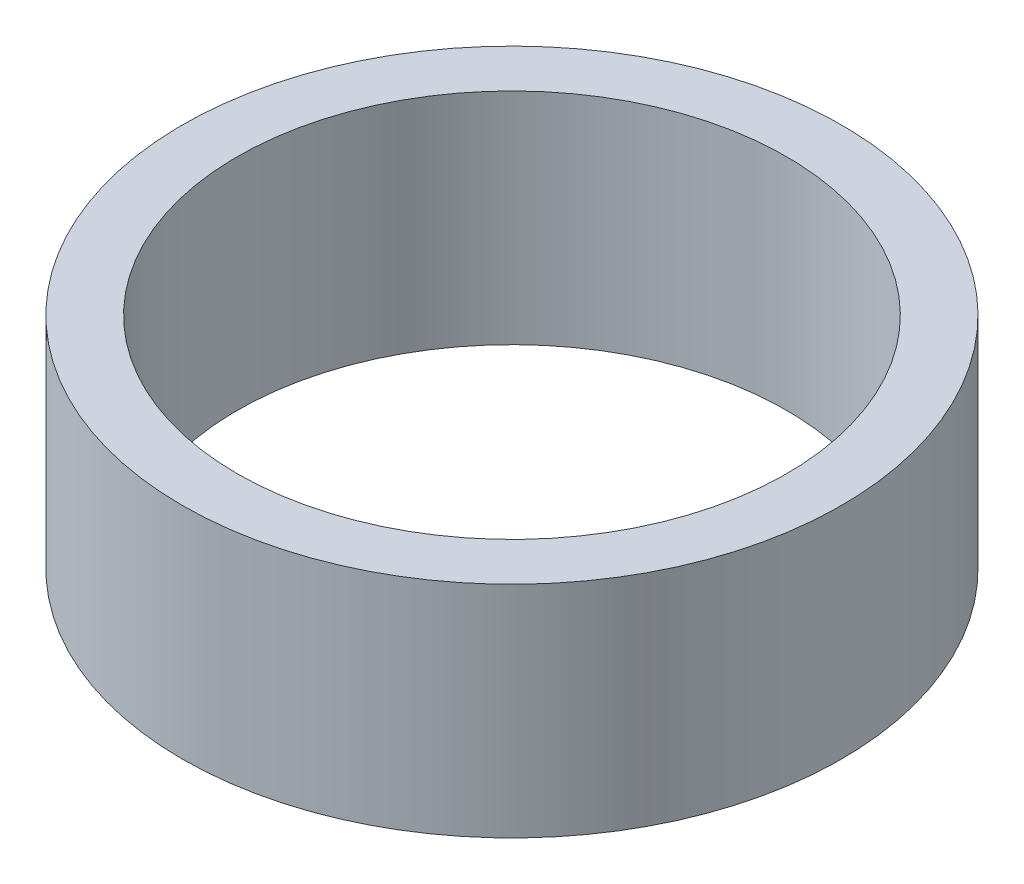
ISO-10303-21;
HEADER;
FILE_DESCRIPTION(('STEP AP214'),'2;1');
FILE_NAME('part.step','',(''),(''),'','','');
FILE_SCHEMA(('AUTOMOTIVE_DESIGN { 1 0 10303 214 1 1 1 1 }'));
ENDSEC;
DATA;
#1=APPLICATION_CONTEXT('core data for automotive mechanical design processes');
#2=APPLICATION_PROTOCOL_DEFINITION('international standard','automotive_design',2000,#1);
#3=PRODUCT_CONTEXT('',#1,'mechanical');
#4=PRODUCT('Part','Part','',(#3));
#5=PRODUCT_RELATED_PRODUCT_CATEGORY('part','',(#4));
#6=PRODUCT_DEFINITION_FORMATION('','',#4);
#7=PRODUCT_DEFINITION_CONTEXT('part definition',#1,'design');
#8=PRODUCT_DEFINITION('design','',#6,#7);
#9=PRODUCT_DEFINITION_SHAPE('','',#8);
#10=(LENGTH_UNIT() NAMED_UNIT(*) SI_UNIT(.MILLI.,.METRE.));
#11=(NAMED_UNIT(*) PLANE_ANGLE_UNIT() SI_UNIT($,.RADIAN.));
#12=(NAMED_UNIT(*) SI_UNIT($,.STERADIAN.) SOLID_ANGLE_UNIT());
#13=UNCERTAINTY_MEASURE_WITH_UNIT(LENGTH_MEASURE(1.E-05),#10,'distance_accuracy_value','');
#14=(GEOMETRIC_REPRESENTATION_CONTEXT(3) GLOBAL_UNCERTAINTY_ASSIGNED_CONTEXT((#13)) GLOBAL_UNIT_ASSIGNED_CONTEXT((#10,
#11,#12)) REPRESENTATION_CONTEXT('',''));
#15=CARTESIAN_POINT('',(0.,0.,0.));
#16=DIRECTION('',(0.,0.,1.));
#17=DIRECTION('',(1.,0.,0.));
#18=AXIS2_PLACEMENT_3D('',#15,#16,#17);
#19=CARTESIAN_POINT('',(0.,0.508,0.));
#20=DIRECTION('',(0.,1.,0.));
#21=DIRECTION('',(0.,0.,1.));
#22=AXIS2_PLACEMENT_3D('',#19,#20,#21);
#23=PLANE('',#22);
#24=CARTESIAN_POINT('',(0.,0.508,0.));
#25=DIRECTION('',(0.,1.,0.));
#26=DIRECTION('',(0.,0.,1.));
#27=AXIS2_PLACEMENT_3D('',#24,#25,#26);
#28=CIRCLE('',#27,0.762);
#29=CARTESIAN_POINT('',(0.,0.508,0.762));
#30=VERTEX_POINT('',#29);
#31=EDGE_CURVE('E10',#30,#30,#28,.T.);
#32=ORIENTED_EDGE('',*,*,#31,.T.);
#33=EDGE_LOOP('',(#32));
#34=FACE_BOUND('',#33,.T.);
#35=CARTESIAN_POINT('',(0.,0.508,0.));
#36=DIRECTION('',(0.,1.,0.));
#37=DIRECTION('',(0.,0.,1.));
#38=AXIS2_PLACEMENT_3D('',#35,#36,#37);
#39=CIRCLE('',#38,0.635);
#40=CARTESIAN_POINT('',(0.,0.508,0.635));
#41=VERTEX_POINT('',#40);
#42=EDGE_CURVE('E50',#41,#41,#39,.T.);
#43=ORIENTED_EDGE('',*,*,#42,.F.);
#44=EDGE_LOOP('',(#43));
#45=FACE_BOUND('',#44,.T.);
#46=ADVANCED_FACE('F39',(#34,#45),#23,.T.);
#47=CARTESIAN_POINT('',(0.,0.,0.));
#48=DIRECTION('',(0.,1.,0.));
#49=DIRECTION('',(0.,0.,1.));
#50=AXIS2_PLACEMENT_3D('',#47,#48,#49);
#51=PLANE('',#50);
#52=CARTESIAN_POINT('',(0.,0.,0.));
#53=DIRECTION('',(0.,1.,0.));
#54=DIRECTION('',(0.,0.,1.));
#55=AXIS2_PLACEMENT_3D('',#52,#53,#54);
#56=CIRCLE('',#55,0.762);
#57=CARTESIAN_POINT('',(0.,0.,0.762));
#58=VERTEX_POINT('',#57);
#59=EDGE_CURVE('E43',#58,#58,#56,.T.);
#60=ORIENTED_EDGE('',*,*,#59,.F.);
#61=EDGE_LOOP('',(#60));
#62=FACE_BOUND('',#61,.T.);
#63=CARTESIAN_POINT('',(0.,0.,0.));
#64=DIRECTION('',(0.,1.,0.));
#65=DIRECTION('',(0.,0.,1.));
#66=AXIS2_PLACEMENT_3D('',#63,#64,#65);
#67=CIRCLE('',#66,0.635);
#68=CARTESIAN_POINT('',(0.,0.,0.635));
#69=VERTEX_POINT('',#68);
#70=EDGE_CURVE('E52',#69,#69,#67,.T.);
#71=ORIENTED_EDGE('',*,*,#70,.T.);
#72=EDGE_LOOP('',(#71));
#73=FACE_BOUND('',#72,.T.);
#74=ADVANCED_FACE('F62',(#62,#73),#51,.F.);
#75=CARTESIAN_POINT('',(0.,0.508,0.));
#76=DIRECTION('',(0.,-1.,0.));
#77=DIRECTION('',(0.,0.,-1.));
#78=AXIS2_PLACEMENT_3D('',#75,#76,#77);
#79=CYLINDRICAL_SURFACE('',#78,0.762);
#80=ORIENTED_EDGE('',*,*,#31,.F.);
#81=EDGE_LOOP('',(#80));
#82=FACE_BOUND('',#81,.T.);
#83=ORIENTED_EDGE('',*,*,#59,.T.);
#84=EDGE_LOOP('',(#83));
#85=FACE_BOUND('',#84,.T.);
#86=ADVANCED_FACE('F41',(#82,#85),#79,.T.);
#87=CARTESIAN_POINT('',(0.,0.508,0.));
#88=DIRECTION('',(0.,-1.,0.));
#89=DIRECTION('',(0.,0.,-1.));
#90=AXIS2_PLACEMENT_3D('',#87,#88,#89);
#91=CYLINDRICAL_SURFACE('',#90,0.635);
#92=ORIENTED_EDGE('',*,*,#42,.T.);
#93=EDGE_LOOP('',(#92));
#94=FACE_BOUND('',#93,.T.);
#95=ORIENTED_EDGE('',*,*,#70,.F.);
#96=EDGE_LOOP('',(#95));
#97=FACE_BOUND('',#96,.T.);
#98=ADVANCED_FACE('F58',(#94,#97),#91,.F.);
#99=CLOSED_SHELL('',(#46,#74,#86,#98));
#100=MANIFOLD_SOLID_BREP('B2',#99);
#101=ADVANCED_BREP_SHAPE_REPRESENTATION('',(#18,#100),#14);
#102=SHAPE_DEFINITION_REPRESENTATION(#9,#101);
ENDSEC;
END-ISO-10303-21;
